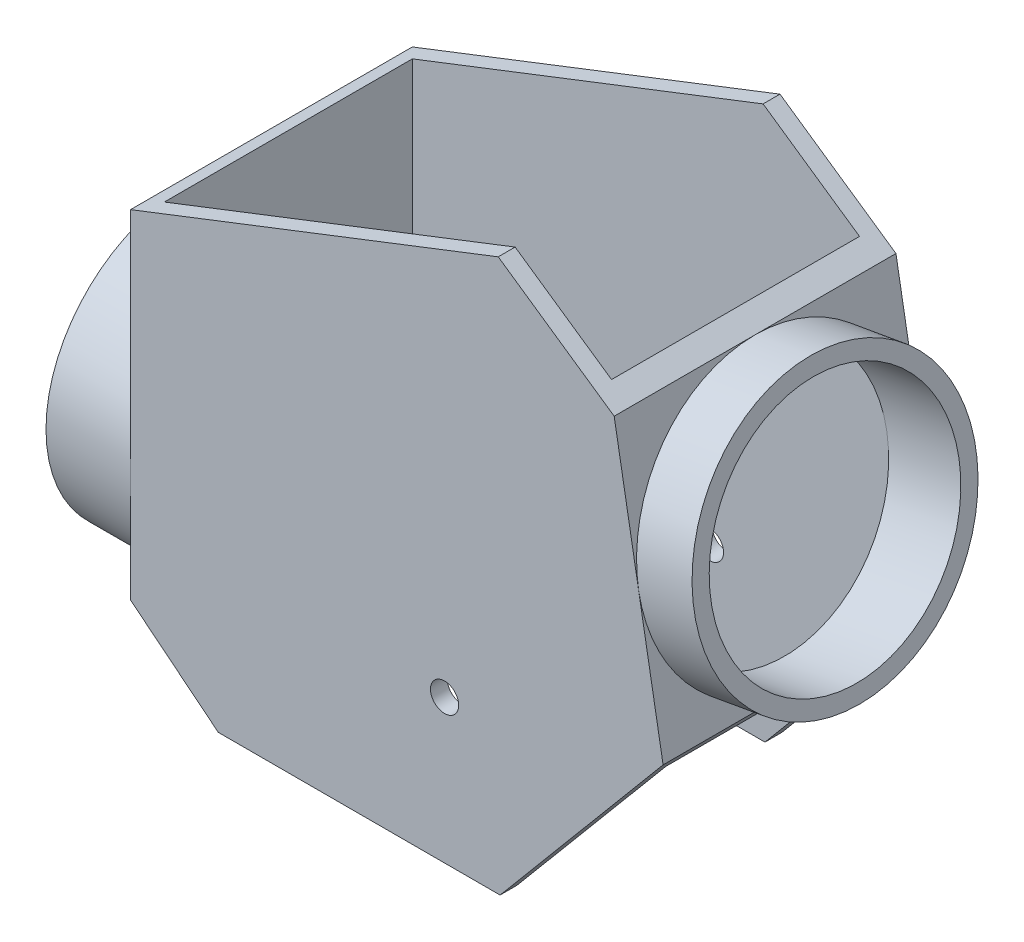
ISO-10303-21;
HEADER;
FILE_DESCRIPTION(('STEP AP214'),'2;1');
FILE_NAME('part.step','',(''),(''),'','','');
FILE_SCHEMA(('AUTOMOTIVE_DESIGN { 1 0 10303 214 1 1 1 1 }'));
ENDSEC;
DATA;
#1=APPLICATION_CONTEXT('core data for automotive mechanical design processes');
#2=APPLICATION_PROTOCOL_DEFINITION('international standard','automotive_design',2000,#1);
#3=PRODUCT_CONTEXT('',#1,'mechanical');
#4=PRODUCT('Part','Part','',(#3));
#5=PRODUCT_RELATED_PRODUCT_CATEGORY('part','',(#4));
#6=PRODUCT_DEFINITION_FORMATION('','',#4);
#7=PRODUCT_DEFINITION_CONTEXT('part definition',#1,'design');
#8=PRODUCT_DEFINITION('design','',#6,#7);
#9=PRODUCT_DEFINITION_SHAPE('','',#8);
#10=(LENGTH_UNIT() NAMED_UNIT(*) SI_UNIT(.MILLI.,.METRE.));
#11=(NAMED_UNIT(*) PLANE_ANGLE_UNIT() SI_UNIT($,.RADIAN.));
#12=(NAMED_UNIT(*) SI_UNIT($,.STERADIAN.) SOLID_ANGLE_UNIT());
#13=UNCERTAINTY_MEASURE_WITH_UNIT(LENGTH_MEASURE(1.E-05),#10,'distance_accuracy_value','');
#14=(GEOMETRIC_REPRESENTATION_CONTEXT(3) GLOBAL_UNCERTAINTY_ASSIGNED_CONTEXT((#13)) GLOBAL_UNIT_ASSIGNED_CONTEXT((#10,
#11,#12)) REPRESENTATION_CONTEXT('',''));
#15=CARTESIAN_POINT('',(0.,0.,0.));
#16=DIRECTION('',(0.,0.,1.));
#17=DIRECTION('',(1.,0.,0.));
#18=AXIS2_PLACEMENT_3D('',#15,#16,#17);
#19=CARTESIAN_POINT('',(33.7650635866321,-34.9755715163721,50.));
#20=DIRECTION('',(0.,1.,0.));
#21=DIRECTION('',(-1.,0.,0.));
#22=AXIS2_PLACEMENT_3D('',#19,#20,#21);
#23=PLANE('',#22);
#24=DIRECTION('',(1.,0.,0.));
#25=VECTOR('',#24,1.);
#26=CARTESIAN_POINT('',(0.,-34.9755715163721,3.));
#27=LINE('',#26,#25);
#28=CARTESIAN_POINT('',(-11.4528098654168,-34.9755715163721,3.));
#29=VERTEX_POINT('',#28);
#30=CARTESIAN_POINT('',(33.7650635866321,-34.9755715163721,3.));
#31=VERTEX_POINT('',#30);
#32=EDGE_CURVE('E227',#29,#31,#27,.T.);
#33=ORIENTED_EDGE('',*,*,#32,.F.);
#34=DIRECTION('',(0.,0.,-1.));
#35=VECTOR('',#34,1.);
#36=CARTESIAN_POINT('',(-11.4528098654168,-34.9755715163721,50.));
#37=LINE('',#36,#35);
#38=CARTESIAN_POINT('',(-11.4528098654168,-34.9755715163721,47.));
#39=VERTEX_POINT('',#38);
#40=EDGE_CURVE('E261',#39,#29,#37,.T.);
#41=ORIENTED_EDGE('',*,*,#40,.F.);
#42=DIRECTION('',(1.,0.,0.));
#43=VECTOR('',#42,1.);
#44=CARTESIAN_POINT('',(0.,-34.9755715163721,47.));
#45=LINE('',#44,#43);
#46=CARTESIAN_POINT('',(33.7650635866321,-34.9755715163721,47.));
#47=VERTEX_POINT('',#46);
#48=EDGE_CURVE('E229',#39,#47,#45,.T.);
#49=ORIENTED_EDGE('',*,*,#48,.T.);
#50=DIRECTION('',(0.,0.,-1.));
#51=VECTOR('',#50,1.);
#52=CARTESIAN_POINT('',(33.7650635866321,-34.9755715163721,50.));
#53=LINE('',#52,#51);
#54=CARTESIAN_POINT('',(33.7650635866321,-34.9755715163721,50.));
#55=VERTEX_POINT('',#54);
#56=EDGE_CURVE('E343',#55,#47,#53,.T.);
#57=ORIENTED_EDGE('',*,*,#56,.F.);
#58=DIRECTION('',(1.,0.,0.));
#59=VECTOR('',#58,1.);
#60=CARTESIAN_POINT('',(33.7650635866321,-34.9755715163721,50.));
#61=LINE('',#60,#59);
#62=CARTESIAN_POINT('',(-16.2349364133679,-34.9755715163721,50.));
#63=VERTEX_POINT('',#62);
#64=EDGE_CURVE('E296',#63,#55,#61,.T.);
#65=ORIENTED_EDGE('',*,*,#64,.F.);
#66=DIRECTION('',(0.,0.,-1.));
#67=VECTOR('',#66,1.);
#68=CARTESIAN_POINT('',(-16.2349364133679,-34.9755715163721,50.));
#69=LINE('',#68,#67);
#70=CARTESIAN_POINT('',(-16.2349364133679,-34.9755715163721,0.));
#71=VERTEX_POINT('',#70);
#72=EDGE_CURVE('E346',#63,#71,#69,.T.);
#73=ORIENTED_EDGE('',*,*,#72,.T.);
#74=DIRECTION('',(1.,0.,0.));
#75=VECTOR('',#74,1.);
#76=CARTESIAN_POINT('',(33.7650635866321,-34.9755715163721,0.));
#77=LINE('',#76,#75);
#78=CARTESIAN_POINT('',(33.7650635866321,-34.9755715163721,0.));
#79=VERTEX_POINT('',#78);
#80=EDGE_CURVE('E314',#71,#79,#77,.T.);
#81=ORIENTED_EDGE('',*,*,#80,.T.);
#82=EDGE_CURVE('E342',#31,#79,#53,.T.);
#83=ORIENTED_EDGE('',*,*,#82,.F.);
#84=EDGE_LOOP('',(#33,#41,#49,#57,#65,#73,#81,#83));
#85=FACE_BOUND('',#84,.T.);
#86=ADVANCED_FACE('F32',(#85),#23,.F.);
#87=CARTESIAN_POINT('',(33.7650635866321,-34.9755715163721,50.));
#88=DIRECTION('',(-0.766044443118974,0.642787609686544,0.));
#89=DIRECTION('',(-0.642787609686544,-0.766044443118974,0.));
#90=AXIS2_PLACEMENT_3D('',#87,#88,#89);
#91=PLANE('',#90);
#92=DIRECTION('',(0.642787609686544,0.766044443118974,0.));
#93=VECTOR('',#92,1.);
#94=CARTESIAN_POINT('',(37.0362596713073,-31.0771118303803,3.));
#95=LINE('',#94,#93);
#96=CARTESIAN_POINT('',(60.1732071289947,-3.50357157601824,3.));
#97=VERTEX_POINT('',#96);
#98=EDGE_CURVE('E248',#31,#97,#95,.T.);
#99=ORIENTED_EDGE('',*,*,#98,.F.);
#100=ORIENTED_EDGE('',*,*,#82,.T.);
#101=DIRECTION('',(0.642787609686543,0.766044443118974,0.));
#102=VECTOR('',#101,1.);
#103=CARTESIAN_POINT('',(33.7650635866321,-34.9755715163721,0.));
#104=LINE('',#103,#102);
#105=CARTESIAN_POINT('',(62.6905060225265,-0.503571576018255,0.));
#106=VERTEX_POINT('',#105);
#107=EDGE_CURVE('E317',#79,#106,#104,.T.);
#108=ORIENTED_EDGE('',*,*,#107,.T.);
#109=DIRECTION('',(0.,0.,-1.));
#110=VECTOR('',#109,1.);
#111=CARTESIAN_POINT('',(62.6905060225265,-0.503571576018255,50.));
#112=LINE('',#111,#110);
#113=CARTESIAN_POINT('',(62.6905060225265,-0.503571576018248,25.));
#114=VERTEX_POINT('',#113);
#115=EDGE_CURVE('E338',#114,#106,#112,.T.);
#116=ORIENTED_EDGE('',*,*,#115,.F.);
#117=CARTESIAN_POINT('',(62.6905060225265,-0.503571576018255,50.));
#118=VERTEX_POINT('',#117);
#119=EDGE_CURVE('E339',#118,#114,#112,.T.);
#120=ORIENTED_EDGE('',*,*,#119,.F.);
#121=DIRECTION('',(0.642787609686543,0.766044443118974,0.));
#122=VECTOR('',#121,1.);
#123=CARTESIAN_POINT('',(33.7650635866321,-34.9755715163721,50.));
#124=LINE('',#123,#122);
#125=EDGE_CURVE('E298',#55,#118,#124,.T.);
#126=ORIENTED_EDGE('',*,*,#125,.F.);
#127=ORIENTED_EDGE('',*,*,#56,.T.);
#128=DIRECTION('',(0.642787609686544,0.766044443118974,0.));
#129=VECTOR('',#128,1.);
#130=CARTESIAN_POINT('',(37.0362596713073,-31.0771118303803,47.));
#131=LINE('',#130,#129);
#132=CARTESIAN_POINT('',(60.1732071289947,-3.50357157601824,47.));
#133=VERTEX_POINT('',#132);
#134=EDGE_CURVE('E234',#47,#133,#131,.T.);
#135=ORIENTED_EDGE('',*,*,#134,.T.);
#136=DIRECTION('',(0.,0.,-1.));
#137=VECTOR('',#136,1.);
#138=CARTESIAN_POINT('',(60.1732071289947,-3.50357157601824,50.));
#139=LINE('',#138,#137);
#140=EDGE_CURVE('E258',#133,#97,#139,.T.);
#141=ORIENTED_EDGE('',*,*,#140,.T.);
#142=EDGE_LOOP('',(#99,#100,#108,#116,#120,#126,#127,#135,#141));
#143=FACE_BOUND('',#142,.T.);
#144=ADVANCED_FACE('F419',(#143),#91,.F.);
#145=CARTESIAN_POINT('',(54.0080971391801,48.7368160745922,50.));
#146=DIRECTION('',(-0.568007364011867,-0.823023471371437,0.));
#147=DIRECTION('',(0.823023471371437,-0.568007364011867,0.));
#148=AXIS2_PLACEMENT_3D('',#145,#146,#147);
#149=PLANE('',#148);
#150=DIRECTION('',(-0.823023471371437,0.568007364011867,0.));
#151=VECTOR('',#150,1.);
#152=CARTESIAN_POINT('',(40.2084122579267,58.2606302867602,3.));
#153=LINE('',#152,#151);
#154=CARTESIAN_POINT('',(50.5397484893658,51.1304872669488,3.));
#155=VERTEX_POINT('',#154);
#156=CARTESIAN_POINT('',(33.4325103548942,62.9370001748888,3.));
#157=VERTEX_POINT('',#156);
#158=EDGE_CURVE('E242',#155,#157,#153,.T.);
#159=ORIENTED_EDGE('',*,*,#158,.F.);
#160=DIRECTION('',(0.,0.,-1.));
#161=VECTOR('',#160,1.);
#162=CARTESIAN_POINT('',(50.5397484893658,51.1304872669488,50.));
#163=LINE('',#162,#161);
#164=CARTESIAN_POINT('',(50.5397484893658,51.1304872669488,47.));
#165=VERTEX_POINT('',#164);
#166=EDGE_CURVE('E251',#165,#155,#163,.T.);
#167=ORIENTED_EDGE('',*,*,#166,.F.);
#168=DIRECTION('',(-0.823023471371437,0.568007364011867,0.));
#169=VECTOR('',#168,1.);
#170=CARTESIAN_POINT('',(40.2084122579267,58.2606302867602,47.));
#171=LINE('',#170,#169);
#172=CARTESIAN_POINT('',(33.4325103548942,62.9370001748888,47.));
#173=VERTEX_POINT('',#172);
#174=EDGE_CURVE('E231',#165,#173,#171,.T.);
#175=ORIENTED_EDGE('',*,*,#174,.T.);
#176=DIRECTION('',(0.,0.,-1.));
#177=VECTOR('',#176,1.);
#178=CARTESIAN_POINT('',(33.4325103548942,62.9370001748888,50.));
#179=LINE('',#178,#177);
#180=CARTESIAN_POINT('',(33.4325103548942,62.9370001748888,50.));
#181=VERTEX_POINT('',#180);
#182=EDGE_CURVE('E332',#181,#173,#179,.T.);
#183=ORIENTED_EDGE('',*,*,#182,.F.);
#184=DIRECTION('',(-0.823023471371437,0.568007364011867,0.));
#185=VECTOR('',#184,1.);
#186=CARTESIAN_POINT('',(54.0080971391801,48.7368160745922,50.));
#187=LINE('',#186,#185);
#188=CARTESIAN_POINT('',(54.0080971391801,48.7368160745922,50.));
#189=VERTEX_POINT('',#188);
#190=EDGE_CURVE('E304',#189,#181,#187,.T.);
#191=ORIENTED_EDGE('',*,*,#190,.F.);
#192=DIRECTION('',(0.,0.,-1.));
#193=VECTOR('',#192,1.);
#194=CARTESIAN_POINT('',(54.0080971391801,48.7368160745922,50.));
#195=LINE('',#194,#193);
#196=CARTESIAN_POINT('',(54.0080971391801,48.7368160745922,25.));
#197=VERTEX_POINT('',#196);
#198=EDGE_CURVE('E336',#189,#197,#195,.T.);
#199=ORIENTED_EDGE('',*,*,#198,.T.);
#200=CARTESIAN_POINT('',(54.0080971391801,48.7368160745922,0.));
#201=VERTEX_POINT('',#200);
#202=EDGE_CURVE('E335',#197,#201,#195,.T.);
#203=ORIENTED_EDGE('',*,*,#202,.T.);
#204=DIRECTION('',(-0.823023471371437,0.568007364011867,0.));
#205=VECTOR('',#204,1.);
#206=CARTESIAN_POINT('',(54.0080971391801,48.7368160745922,0.));
#207=LINE('',#206,#205);
#208=CARTESIAN_POINT('',(33.4325103548942,62.9370001748888,0.));
#209=VERTEX_POINT('',#208);
#210=EDGE_CURVE('E324',#201,#209,#207,.T.);
#211=ORIENTED_EDGE('',*,*,#210,.T.);
#212=EDGE_CURVE('E331',#157,#209,#179,.T.);
#213=ORIENTED_EDGE('',*,*,#212,.F.);
#214=EDGE_LOOP('',(#159,#167,#175,#183,#191,#199,#203,#211,#213));
#215=FACE_BOUND('',#214,.T.);
#216=ADVANCED_FACE('F394',(#215),#149,.F.);
#217=CARTESIAN_POINT('',(33.4325103548942,62.9370001748888,50.));
#218=DIRECTION('',(0.362369318244743,-0.932034590127877,0.));
#219=DIRECTION('',(0.932034590127877,0.362369318244743,0.));
#220=AXIS2_PLACEMENT_3D('',#217,#218,#219);
#221=PLANE('',#220);
#222=DIRECTION('',(-0.932034590127877,-0.362369318244743,0.));
#223=VECTOR('',#222,1.);
#224=CARTESIAN_POINT('',(-16.8663151039342,43.3811260870761,3.));
#225=LINE('',#224,#223);
#226=CARTESIAN_POINT('',(-28.8099109540572,38.7375294529576,3.));
#227=VERTEX_POINT('',#226);
#228=EDGE_CURVE('E202',#157,#227,#225,.T.);
#229=ORIENTED_EDGE('',*,*,#228,.F.);
#230=ORIENTED_EDGE('',*,*,#212,.T.);
#231=DIRECTION('',(-0.932034590127877,-0.362369318244743,0.));
#232=VECTOR('',#231,1.);
#233=CARTESIAN_POINT('',(33.4325103548942,62.9370001748888,0.));
#234=LINE('',#233,#232);
#235=CARTESIAN_POINT('',(-31.8099109540572,37.5711478977569,0.));
#236=VERTEX_POINT('',#235);
#237=EDGE_CURVE('E327',#209,#236,#234,.T.);
#238=ORIENTED_EDGE('',*,*,#237,.T.);
#239=DIRECTION('',(0.,0.,-1.));
#240=VECTOR('',#239,1.);
#241=CARTESIAN_POINT('',(-31.8099109540572,37.5711478977569,50.));
#242=LINE('',#241,#240);
#243=CARTESIAN_POINT('',(-31.8099109540572,37.5711478977569,50.));
#244=VERTEX_POINT('',#243);
#245=EDGE_CURVE('E308',#244,#236,#242,.T.);
#246=ORIENTED_EDGE('',*,*,#245,.F.);
#247=DIRECTION('',(-0.932034590127877,-0.362369318244743,0.));
#248=VECTOR('',#247,1.);
#249=CARTESIAN_POINT('',(33.4325103548942,62.9370001748888,50.));
#250=LINE('',#249,#248);
#251=EDGE_CURVE('E306',#181,#244,#250,.T.);
#252=ORIENTED_EDGE('',*,*,#251,.F.);
#253=ORIENTED_EDGE('',*,*,#182,.T.);
#254=DIRECTION('',(-0.932034590127877,-0.362369318244743,0.));
#255=VECTOR('',#254,1.);
#256=CARTESIAN_POINT('',(-16.8663151039342,43.3811260870761,47.));
#257=LINE('',#256,#255);
#258=CARTESIAN_POINT('',(-28.8099109540572,38.7375294529576,47.));
#259=VERTEX_POINT('',#258);
#260=EDGE_CURVE('E252',#173,#259,#257,.T.);
#261=ORIENTED_EDGE('',*,*,#260,.T.);
#262=DIRECTION('',(0.,0.,-1.));
#263=VECTOR('',#262,1.);
#264=CARTESIAN_POINT('',(-28.8099109540572,38.7375294529576,50.));
#265=LINE('',#264,#263);
#266=EDGE_CURVE('E249',#259,#227,#265,.T.);
#267=ORIENTED_EDGE('',*,*,#266,.T.);
#268=EDGE_LOOP('',(#229,#230,#238,#246,#252,#253,#261,#267));
#269=FACE_BOUND('',#268,.T.);
#270=ADVANCED_FACE('F389',(#269),#221,.F.);
#271=CARTESIAN_POINT('',(-31.8099109540572,37.5711478977569,50.));
#272=DIRECTION('',(1.,0.,0.));
#273=DIRECTION('',(0.,0.,-1.));
#274=AXIS2_PLACEMENT_3D('',#271,#272,#273);
#275=PLANE('',#274);
#276=CARTESIAN_POINT('',(-31.8099109540572,-3.70221180930763,25.));
#277=DIRECTION('',(1.,0.,0.));
#278=DIRECTION('',(0.,0.,-1.));
#279=AXIS2_PLACEMENT_3D('',#276,#277,#278);
#280=CIRCLE('',#279,25.);
#281=CARTESIAN_POINT('',(-31.8099109540572,-3.70221180930763,0.));
#282=VERTEX_POINT('',#281);
#283=CARTESIAN_POINT('',(-31.8099109540572,-22.4288521022431,8.43760454103923));
#284=VERTEX_POINT('',#283);
#285=EDGE_CURVE('E280',#282,#284,#280,.F.);
#286=ORIENTED_EDGE('',*,*,#285,.F.);
#287=DIRECTION('',(0.,-1.,0.));
#288=VECTOR('',#287,1.);
#289=CARTESIAN_POINT('',(-31.8099109540572,37.5711478977569,0.));
#290=LINE('',#289,#288);
#291=CARTESIAN_POINT('',(-31.8099109540572,-22.4288521022431,0.));
#292=VERTEX_POINT('',#291);
#293=EDGE_CURVE('E286',#282,#292,#290,.T.);
#294=ORIENTED_EDGE('',*,*,#293,.T.);
#295=DIRECTION('',(0.,0.,-1.));
#296=VECTOR('',#295,1.);
#297=CARTESIAN_POINT('',(-31.8099109540572,-22.4288521022431,50.));
#298=LINE('',#297,#296);
#299=EDGE_CURVE('E348',#284,#292,#298,.T.);
#300=ORIENTED_EDGE('',*,*,#299,.F.);
#301=EDGE_LOOP('',(#286,#294,#300));
#302=FACE_BOUND('',#301,.T.);
#303=ADVANCED_FACE('F363',(#302),#275,.F.);
#304=CARTESIAN_POINT('',(-31.8099109540572,-22.4288521022431,41.5623954589608));
#305=VERTEX_POINT('',#304);
#306=CARTESIAN_POINT('',(-31.8099109540572,-3.70221180930763,50.));
#307=VERTEX_POINT('',#306);
#308=EDGE_CURVE('E279',#305,#307,#280,.F.);
#309=ORIENTED_EDGE('',*,*,#308,.F.);
#310=CARTESIAN_POINT('',(-31.8099109540572,-22.4288521022431,50.));
#311=VERTEX_POINT('',#310);
#312=EDGE_CURVE('E349',#311,#305,#298,.T.);
#313=ORIENTED_EDGE('',*,*,#312,.F.);
#314=DIRECTION('',(0.,-1.,0.));
#315=VECTOR('',#314,1.);
#316=CARTESIAN_POINT('',(-31.8099109540572,37.5711478977569,50.));
#317=LINE('',#316,#315);
#318=EDGE_CURVE('E294',#307,#311,#317,.T.);
#319=ORIENTED_EDGE('',*,*,#318,.F.);
#320=EDGE_LOOP('',(#309,#313,#319));
#321=FACE_BOUND('',#320,.T.);
#322=ADVANCED_FACE('F378',(#321),#275,.F.);
#323=CARTESIAN_POINT('',(62.6905060225265,-0.503571576018255,50.));
#324=DIRECTION('',(-0.984807753012208,-0.173648177666928,0.));
#325=DIRECTION('',(0.173648177666928,-0.984807753012209,0.));
#326=AXIS2_PLACEMENT_3D('',#323,#324,#325);
#327=PLANE('',#326);
#328=CARTESIAN_POINT('',(58.3493015808533,24.116622249287,25.));
#329=DIRECTION('',(0.984807753012208,0.173648177666928,0.));
#330=DIRECTION('',(-0.173648177666928,0.984807753012208,0.));
#331=AXIS2_PLACEMENT_3D('',#328,#329,#330);
#332=CIRCLE('',#331,25.);
#333=CARTESIAN_POINT('',(58.3493015808533,24.116622249287,50.));
#334=VERTEX_POINT('',#333);
#335=EDGE_CURVE('E43',#197,#334,#332,.T.);
#336=ORIENTED_EDGE('',*,*,#335,.F.);
#337=ORIENTED_EDGE('',*,*,#198,.F.);
#338=DIRECTION('',(-0.173648177666928,0.984807753012208,0.));
#339=VECTOR('',#338,1.);
#340=CARTESIAN_POINT('',(62.6905060225265,-0.503571576018255,50.));
#341=LINE('',#340,#339);
#342=EDGE_CURVE('E300',#334,#189,#341,.T.);
#343=ORIENTED_EDGE('',*,*,#342,.F.);
#344=EDGE_LOOP('',(#336,#337,#343));
#345=FACE_BOUND('',#344,.T.);
#346=ADVANCED_FACE('F414',(#345),#327,.F.);
#347=EDGE_CURVE('E11',#334,#114,#332,.T.);
#348=ORIENTED_EDGE('',*,*,#347,.F.);
#349=EDGE_CURVE('E301',#118,#334,#341,.T.);
#350=ORIENTED_EDGE('',*,*,#349,.F.);
#351=ORIENTED_EDGE('',*,*,#119,.T.);
#352=EDGE_LOOP('',(#348,#350,#351));
#353=FACE_BOUND('',#352,.T.);
#354=ADVANCED_FACE('F411',(#353),#327,.F.);
#355=CARTESIAN_POINT('',(58.3493015808533,24.116622249287,0.));
#356=VERTEX_POINT('',#355);
#357=EDGE_CURVE('E41',#114,#356,#332,.T.);
#358=ORIENTED_EDGE('',*,*,#357,.F.);
#359=ORIENTED_EDGE('',*,*,#115,.T.);
#360=DIRECTION('',(-0.173648177666928,0.984807753012208,0.));
#361=VECTOR('',#360,1.);
#362=CARTESIAN_POINT('',(62.6905060225265,-0.503571576018255,0.));
#363=LINE('',#362,#361);
#364=EDGE_CURVE('E321',#106,#356,#363,.T.);
#365=ORIENTED_EDGE('',*,*,#364,.T.);
#366=EDGE_LOOP('',(#358,#359,#365));
#367=FACE_BOUND('',#366,.T.);
#368=ADVANCED_FACE('F404',(#367),#327,.F.);
#369=EDGE_CURVE('E276',#307,#282,#280,.F.);
#370=ORIENTED_EDGE('',*,*,#369,.F.);
#371=EDGE_CURVE('E290',#244,#307,#317,.T.);
#372=ORIENTED_EDGE('',*,*,#371,.F.);
#373=ORIENTED_EDGE('',*,*,#245,.T.);
#374=EDGE_CURVE('E309',#236,#282,#290,.T.);
#375=ORIENTED_EDGE('',*,*,#374,.T.);
#376=EDGE_LOOP('',(#370,#372,#373,#375));
#377=FACE_BOUND('',#376,.T.);
#378=ADVANCED_FACE('F34',(#377),#275,.F.);
#379=CARTESIAN_POINT('',(-31.8099109540572,-22.4288521022431,50.));
#380=DIRECTION('',(0.627335970706448,0.778748727034464,0.));
#381=DIRECTION('',(-0.778748727034464,0.627335970706448,0.));
#382=AXIS2_PLACEMENT_3D('',#379,#380,#381);
#383=PLANE('',#382);
#384=CARTESIAN_POINT('',(-55.0563816981681,-3.70221180930763,25.));
#385=DIRECTION('',(0.627335970706448,0.778748727034464,0.));
#386=DIRECTION('',(0.778748727034464,-0.627335970706448,0.));
#387=AXIS2_PLACEMENT_3D('',#384,#385,#386);
#388=ELLIPSE('',#387,39.8510545662594,25.);
#389=EDGE_CURVE('E281',#284,#305,#388,.F.);
#390=ORIENTED_EDGE('',*,*,#389,.F.);
#391=ORIENTED_EDGE('',*,*,#299,.T.);
#392=DIRECTION('',(0.778748727034464,-0.627335970706449,0.));
#393=VECTOR('',#392,1.);
#394=CARTESIAN_POINT('',(-31.8099109540572,-22.4288521022431,0.));
#395=LINE('',#394,#393);
#396=EDGE_CURVE('E312',#292,#71,#395,.T.);
#397=ORIENTED_EDGE('',*,*,#396,.T.);
#398=ORIENTED_EDGE('',*,*,#72,.F.);
#399=DIRECTION('',(0.778748727034464,-0.627335970706449,0.));
#400=VECTOR('',#399,1.);
#401=CARTESIAN_POINT('',(-31.8099109540572,-22.4288521022431,50.));
#402=LINE('',#401,#400);
#403=EDGE_CURVE('E293',#311,#63,#402,.T.);
#404=ORIENTED_EDGE('',*,*,#403,.F.);
#405=ORIENTED_EDGE('',*,*,#312,.T.);
#406=EDGE_LOOP('',(#390,#391,#397,#398,#404,#405));
#407=FACE_BOUND('',#406,.T.);
#408=ADVANCED_FACE('F357',(#407),#383,.F.);
#409=EDGE_CURVE('E289',#356,#197,#332,.T.);
#410=ORIENTED_EDGE('',*,*,#409,.F.);
#411=EDGE_CURVE('E320',#356,#201,#363,.T.);
#412=ORIENTED_EDGE('',*,*,#411,.T.);
#413=ORIENTED_EDGE('',*,*,#202,.F.);
#414=EDGE_LOOP('',(#410,#412,#413));
#415=FACE_BOUND('',#414,.T.);
#416=ADVANCED_FACE('F401',(#415),#327,.F.);
#417=CARTESIAN_POINT('',(0.,0.,50.));
#418=DIRECTION('',(0.,0.,-1.));
#419=DIRECTION('',(-1.,0.,0.));
#420=AXIS2_PLACEMENT_3D('',#417,#418,#419);
#421=PLANE('',#420);
#422=CARTESIAN_POINT('',(23.9150067404,-9.49997314232794,50.));
#423=DIRECTION('',(0.,0.,1.));
#424=DIRECTION('',(1.,0.,0.));
#425=AXIS2_PLACEMENT_3D('',#422,#423,#424);
#426=CIRCLE('',#425,2.5);
#427=CARTESIAN_POINT('',(26.4150067404,-9.49997314232794,50.));
#428=VERTEX_POINT('',#427);
#429=EDGE_CURVE('E693',#428,#428,#426,.T.);
#430=ORIENTED_EDGE('',*,*,#429,.F.);
#431=EDGE_LOOP('',(#430));
#432=FACE_BOUND('',#431,.T.);
#433=ORIENTED_EDGE('',*,*,#371,.T.);
#434=ORIENTED_EDGE('',*,*,#318,.T.);
#435=ORIENTED_EDGE('',*,*,#403,.T.);
#436=ORIENTED_EDGE('',*,*,#64,.T.);
#437=ORIENTED_EDGE('',*,*,#125,.T.);
#438=ORIENTED_EDGE('',*,*,#349,.T.);
#439=ORIENTED_EDGE('',*,*,#342,.T.);
#440=ORIENTED_EDGE('',*,*,#190,.T.);
#441=ORIENTED_EDGE('',*,*,#251,.T.);
#442=EDGE_LOOP('',(#433,#434,#435,#436,#437,#438,#439,#440,#441));
#443=FACE_BOUND('',#442,.T.);
#444=ADVANCED_FACE('F415',(#432,#443),#421,.F.);
#445=CARTESIAN_POINT('',(0.,0.,0.));
#446=DIRECTION('',(0.,0.,-1.));
#447=DIRECTION('',(-1.,0.,0.));
#448=AXIS2_PLACEMENT_3D('',#445,#446,#447);
#449=PLANE('',#448);
#450=CARTESIAN_POINT('',(23.9150067404,-9.49997314232794,0.));
#451=DIRECTION('',(0.,0.,1.));
#452=DIRECTION('',(1.,0.,0.));
#453=AXIS2_PLACEMENT_3D('',#450,#451,#452);
#454=CIRCLE('',#453,2.5);
#455=CARTESIAN_POINT('',(26.4150067404,-9.49997314232794,0.));
#456=VERTEX_POINT('',#455);
#457=EDGE_CURVE('E694',#456,#456,#454,.T.);
#458=ORIENTED_EDGE('',*,*,#457,.T.);
#459=EDGE_LOOP('',(#458));
#460=FACE_BOUND('',#459,.T.);
#461=ORIENTED_EDGE('',*,*,#293,.F.);
#462=ORIENTED_EDGE('',*,*,#374,.F.);
#463=ORIENTED_EDGE('',*,*,#237,.F.);
#464=ORIENTED_EDGE('',*,*,#210,.F.);
#465=ORIENTED_EDGE('',*,*,#411,.F.);
#466=ORIENTED_EDGE('',*,*,#364,.F.);
#467=ORIENTED_EDGE('',*,*,#107,.F.);
#468=ORIENTED_EDGE('',*,*,#80,.F.);
#469=ORIENTED_EDGE('',*,*,#396,.F.);
#470=EDGE_LOOP('',(#461,#462,#463,#464,#465,#466,#467,#468,#469));
#471=FACE_BOUND('',#470,.T.);
#472=ADVANCED_FACE('F367',(#460,#471),#449,.T.);
#473=CARTESIAN_POINT('',(68.1973791109754,25.8531040259562,25.));
#474=DIRECTION('',(-0.984807753012209,-0.173648177666928,0.));
#475=DIRECTION('',(0.173648177666928,-0.984807753012209,0.));
#476=AXIS2_PLACEMENT_3D('',#473,#474,#475);
#477=CYLINDRICAL_SURFACE('',#476,25.);
#478=CARTESIAN_POINT('',(68.1973791109754,25.8531040259562,25.));
#479=DIRECTION('',(0.984807753012208,0.173648177666928,0.));
#480=DIRECTION('',(-0.173648177666928,0.984807753012208,0.));
#481=AXIS2_PLACEMENT_3D('',#478,#479,#480);
#482=CIRCLE('',#481,25.);
#483=CARTESIAN_POINT('',(63.8561746693022,50.4732978512614,25.));
#484=VERTEX_POINT('',#483);
#485=EDGE_CURVE('E284',#484,#484,#482,.T.);
#486=ORIENTED_EDGE('',*,*,#485,.F.);
#487=EDGE_LOOP('',(#486));
#488=FACE_BOUND('',#487,.T.);
#489=ORIENTED_EDGE('',*,*,#335,.T.);
#490=ORIENTED_EDGE('',*,*,#347,.T.);
#491=ORIENTED_EDGE('',*,*,#357,.T.);
#492=ORIENTED_EDGE('',*,*,#409,.T.);
#493=EDGE_LOOP('',(#489,#490,#491,#492));
#494=FACE_BOUND('',#493,.T.);
#495=ADVANCED_FACE('F407',(#488,#494),#477,.T.);
#496=CARTESIAN_POINT('',(68.1973791109754,25.8531040259562,25.));
#497=DIRECTION('',(0.984807753012208,0.173648177666928,0.));
#498=DIRECTION('',(-0.173648177666928,0.984807753012208,0.));
#499=AXIS2_PLACEMENT_3D('',#496,#497,#498);
#500=PLANE('',#499);
#501=CARTESIAN_POINT('',(68.1973791109754,25.8531040259562,25.));
#502=DIRECTION('',(0.984807753012208,0.173648177666928,0.));
#503=DIRECTION('',(-0.173648177666928,0.984807753012208,0.));
#504=AXIS2_PLACEMENT_3D('',#501,#502,#503);
#505=CIRCLE('',#504,22.);
#506=CARTESIAN_POINT('',(64.377119202303,47.5188745922248,25.));
#507=VERTEX_POINT('',#506);
#508=EDGE_CURVE('E188',#507,#507,#505,.T.);
#509=ORIENTED_EDGE('',*,*,#508,.F.);
#510=EDGE_LOOP('',(#509));
#511=FACE_BOUND('',#510,.T.);
#512=ORIENTED_EDGE('',*,*,#485,.T.);
#513=EDGE_LOOP('',(#512));
#514=FACE_BOUND('',#513,.T.);
#515=ADVANCED_FACE('F481',(#511,#514),#500,.T.);
#516=CARTESIAN_POINT('',(-46.8099109540572,-3.70221180930763,25.));
#517=DIRECTION('',(1.,0.,0.));
#518=DIRECTION('',(0.,0.,-1.));
#519=AXIS2_PLACEMENT_3D('',#516,#517,#518);
#520=CYLINDRICAL_SURFACE('',#519,25.);
#521=CARTESIAN_POINT('',(-46.8099109540572,-3.70221180930763,25.));
#522=DIRECTION('',(-1.,0.,0.));
#523=DIRECTION('',(0.,0.,1.));
#524=AXIS2_PLACEMENT_3D('',#521,#522,#523);
#525=CIRCLE('',#524,25.);
#526=CARTESIAN_POINT('',(-46.8099109540572,-3.70221180930763,50.));
#527=VERTEX_POINT('',#526);
#528=EDGE_CURVE('E238',#527,#527,#525,.T.);
#529=ORIENTED_EDGE('',*,*,#528,.F.);
#530=EDGE_LOOP('',(#529));
#531=FACE_BOUND('',#530,.T.);
#532=ORIENTED_EDGE('',*,*,#369,.T.);
#533=ORIENTED_EDGE('',*,*,#285,.T.);
#534=ORIENTED_EDGE('',*,*,#389,.T.);
#535=ORIENTED_EDGE('',*,*,#308,.T.);
#536=EDGE_LOOP('',(#532,#533,#534,#535));
#537=FACE_BOUND('',#536,.T.);
#538=ADVANCED_FACE('F381',(#531,#537),#520,.T.);
#539=CARTESIAN_POINT('',(-46.8099109540572,-3.70221180930763,25.));
#540=DIRECTION('',(-1.,0.,0.));
#541=DIRECTION('',(0.,0.,1.));
#542=AXIS2_PLACEMENT_3D('',#539,#540,#541);
#543=PLANE('',#542);
#544=CARTESIAN_POINT('',(-46.8099109540572,-3.70221180930763,25.));
#545=DIRECTION('',(-1.,0.,0.));
#546=DIRECTION('',(0.,0.,1.));
#547=AXIS2_PLACEMENT_3D('',#544,#545,#546);
#548=CIRCLE('',#547,22.);
#549=CARTESIAN_POINT('',(-46.8099109540572,-3.70221180930763,47.));
#550=VERTEX_POINT('',#549);
#551=EDGE_CURVE('E210',#550,#550,#548,.T.);
#552=ORIENTED_EDGE('',*,*,#551,.F.);
#553=EDGE_LOOP('',(#552));
#554=FACE_BOUND('',#553,.T.);
#555=ORIENTED_EDGE('',*,*,#528,.T.);
#556=EDGE_LOOP('',(#555));
#557=FACE_BOUND('',#556,.T.);
#558=ADVANCED_FACE('F488',(#554,#557),#543,.T.);
#559=CARTESIAN_POINT('',(-28.8099109540572,37.5711478977569,50.));
#560=DIRECTION('',(1.,0.,0.));
#561=DIRECTION('',(0.,0.,-1.));
#562=AXIS2_PLACEMENT_3D('',#559,#560,#561);
#563=PLANE('',#562);
#564=CARTESIAN_POINT('',(-28.8099109540572,-3.70221180930763,25.));
#565=DIRECTION('',(1.,0.,0.));
#566=DIRECTION('',(0.,0.,-1.));
#567=AXIS2_PLACEMENT_3D('',#564,#565,#566);
#568=CIRCLE('',#567,22.);
#569=CARTESIAN_POINT('',(-28.8099109540572,-3.70221180930763,3.));
#570=VERTEX_POINT('',#569);
#571=CARTESIAN_POINT('',(-28.8099109540572,-20.9932258866626,11.3977637067755));
#572=VERTEX_POINT('',#571);
#573=EDGE_CURVE('E178',#570,#572,#568,.F.);
#574=ORIENTED_EDGE('',*,*,#573,.T.);
#575=DIRECTION('',(0.,0.,-1.));
#576=VECTOR('',#575,1.);
#577=CARTESIAN_POINT('',(-28.8099109540572,-20.9932258866626,50.));
#578=LINE('',#577,#576);
#579=CARTESIAN_POINT('',(-28.8099109540572,-20.9932258866626,3.));
#580=VERTEX_POINT('',#579);
#581=EDGE_CURVE('E194',#572,#580,#578,.T.);
#582=ORIENTED_EDGE('',*,*,#581,.T.);
#583=DIRECTION('',(0.,-1.,0.));
#584=VECTOR('',#583,1.);
#585=CARTESIAN_POINT('',(-28.8099109540572,0.,3.));
#586=LINE('',#585,#584);
#587=EDGE_CURVE('E191',#570,#580,#586,.T.);
#588=ORIENTED_EDGE('',*,*,#587,.F.);
#589=EDGE_LOOP('',(#574,#582,#588));
#590=FACE_BOUND('',#589,.T.);
#591=ADVANCED_FACE('F193',(#590),#563,.T.);
#592=CARTESIAN_POINT('',(-28.8099109540572,-3.70221180930763,25.));
#593=DIRECTION('',(1.,0.,0.));
#594=DIRECTION('',(0.,0.,-1.));
#595=AXIS2_PLACEMENT_3D('',#592,#593,#594);
#596=CIRCLE('',#595,22.);
#597=CARTESIAN_POINT('',(-28.8099109540572,-20.9932258866626,38.6022362932245));
#598=VERTEX_POINT('',#597);
#599=CARTESIAN_POINT('',(-28.8099109540572,-3.70221180930763,47.));
#600=VERTEX_POINT('',#599);
#601=EDGE_CURVE('E209',#598,#600,#596,.F.);
#602=ORIENTED_EDGE('',*,*,#601,.T.);
#603=DIRECTION('',(0.,-1.,0.));
#604=VECTOR('',#603,1.);
#605=CARTESIAN_POINT('',(-28.8099109540572,0.,47.));
#606=LINE('',#605,#604);
#607=CARTESIAN_POINT('',(-28.8099109540572,-20.9932258866626,47.));
#608=VERTEX_POINT('',#607);
#609=EDGE_CURVE('E219',#600,#608,#606,.T.);
#610=ORIENTED_EDGE('',*,*,#609,.T.);
#611=DIRECTION('',(0.,0.,-1.));
#612=VECTOR('',#611,1.);
#613=CARTESIAN_POINT('',(-28.8099109540572,-20.9932258866626,50.));
#614=LINE('',#613,#612);
#615=EDGE_CURVE('E221',#608,#598,#614,.T.);
#616=ORIENTED_EDGE('',*,*,#615,.T.);
#617=EDGE_LOOP('',(#602,#610,#616));
#618=FACE_BOUND('',#617,.T.);
#619=ADVANCED_FACE('F563',(#618),#563,.T.);
#620=CARTESIAN_POINT('',(59.7360827634899,-1.02451610901904,50.));
#621=DIRECTION('',(-0.984807753012208,-0.173648177666928,0.));
#622=DIRECTION('',(0.173648177666928,-0.984807753012209,0.));
#623=AXIS2_PLACEMENT_3D('',#620,#621,#622);
#624=PLANE('',#623);
#625=CARTESIAN_POINT('',(55.3948783218167,23.5956777162862,25.));
#626=DIRECTION('',(-0.984807753012208,-0.173648177666928,0.));
#627=DIRECTION('',(0.173648177666928,-0.984807753012209,0.));
#628=AXIS2_PLACEMENT_3D('',#625,#626,#627);
#629=CIRCLE('',#628,22.);
#630=CARTESIAN_POINT('',(55.3948783218167,23.5956777162862,47.));
#631=VERTEX_POINT('',#630);
#632=CARTESIAN_POINT('',(55.3948783218167,23.5956777162862,3.));
#633=VERTEX_POINT('',#632);
#634=EDGE_CURVE('E235',#631,#633,#629,.F.);
#635=ORIENTED_EDGE('',*,*,#634,.T.);
#636=DIRECTION('',(-0.173648177666928,0.984807753012209,0.));
#637=VECTOR('',#636,1.);
#638=CARTESIAN_POINT('',(57.7596168922758,10.1845788534925,3.));
#639=LINE('',#638,#637);
#640=EDGE_CURVE('E239',#97,#633,#639,.T.);
#641=ORIENTED_EDGE('',*,*,#640,.F.);
#642=ORIENTED_EDGE('',*,*,#140,.F.);
#643=DIRECTION('',(-0.173648177666928,0.984807753012209,0.));
#644=VECTOR('',#643,1.);
#645=CARTESIAN_POINT('',(57.7596168922758,10.1845788534925,47.));
#646=LINE('',#645,#644);
#647=EDGE_CURVE('E50',#133,#631,#646,.T.);
#648=ORIENTED_EDGE('',*,*,#647,.T.);
#649=EDGE_LOOP('',(#635,#641,#642,#648));
#650=FACE_BOUND('',#649,.T.);
#651=ADVANCED_FACE('F422',(#650),#624,.T.);
#652=CARTESIAN_POINT('',(-28.8099109540572,-3.70221180930763,25.));
#653=DIRECTION('',(1.,0.,0.));
#654=DIRECTION('',(0.,0.,-1.));
#655=AXIS2_PLACEMENT_3D('',#652,#653,#654);
#656=CIRCLE('',#655,22.);
#657=EDGE_CURVE('E183',#600,#570,#656,.F.);
#658=ORIENTED_EDGE('',*,*,#657,.T.);
#659=DIRECTION('',(0.,-1.,0.));
#660=VECTOR('',#659,1.);
#661=CARTESIAN_POINT('',(-28.8099109540572,0.,3.));
#662=LINE('',#661,#660);
#663=EDGE_CURVE('E197',#227,#570,#662,.T.);
#664=ORIENTED_EDGE('',*,*,#663,.F.);
#665=ORIENTED_EDGE('',*,*,#266,.F.);
#666=DIRECTION('',(0.,-1.,0.));
#667=VECTOR('',#666,1.);
#668=CARTESIAN_POINT('',(-28.8099109540572,0.,47.));
#669=LINE('',#668,#667);
#670=EDGE_CURVE('E57',#259,#600,#669,.T.);
#671=ORIENTED_EDGE('',*,*,#670,.T.);
#672=EDGE_LOOP('',(#658,#664,#665,#671));
#673=FACE_BOUND('',#672,.T.);
#674=ADVANCED_FACE('F207',(#673),#563,.T.);
#675=CARTESIAN_POINT('',(-29.9279030419379,-20.0926059211398,50.));
#676=DIRECTION('',(0.627335970706448,0.778748727034464,0.));
#677=DIRECTION('',(-0.778748727034464,0.627335970706448,0.));
#678=AXIS2_PLACEMENT_3D('',#675,#676,#677);
#679=PLANE('',#678);
#680=CARTESIAN_POINT('',(-50.2742551502169,-3.70221180930763,25.));
#681=DIRECTION('',(0.627335970706448,0.778748727034464,0.));
#682=DIRECTION('',(0.778748727034464,-0.627335970706448,0.));
#683=AXIS2_PLACEMENT_3D('',#680,#681,#682);
#684=ELLIPSE('',#683,35.0689280183083,22.);
#685=EDGE_CURVE('E185',#572,#598,#684,.F.);
#686=ORIENTED_EDGE('',*,*,#685,.T.);
#687=ORIENTED_EDGE('',*,*,#615,.F.);
#688=DIRECTION('',(0.778748727034464,-0.627335970706448,0.));
#689=VECTOR('',#688,1.);
#690=CARTESIAN_POINT('',(-21.594122015443,-26.8060430394514,47.));
#691=LINE('',#690,#689);
#692=EDGE_CURVE('E218',#608,#39,#691,.T.);
#693=ORIENTED_EDGE('',*,*,#692,.T.);
#694=ORIENTED_EDGE('',*,*,#40,.T.);
#695=DIRECTION('',(0.778748727034464,-0.627335970706448,0.));
#696=VECTOR('',#695,1.);
#697=CARTESIAN_POINT('',(-21.594122015443,-26.8060430394514,3.));
#698=LINE('',#697,#696);
#699=EDGE_CURVE('E205',#580,#29,#698,.T.);
#700=ORIENTED_EDGE('',*,*,#699,.F.);
#701=ORIENTED_EDGE('',*,*,#581,.F.);
#702=EDGE_LOOP('',(#686,#687,#693,#694,#700,#701));
#703=FACE_BOUND('',#702,.T.);
#704=ADVANCED_FACE('F441',(#703),#679,.T.);
#705=CARTESIAN_POINT('',(55.3948783218167,23.5956777162862,25.));
#706=DIRECTION('',(-0.984807753012208,-0.173648177666928,0.));
#707=DIRECTION('',(0.173648177666928,-0.984807753012209,0.));
#708=AXIS2_PLACEMENT_3D('',#705,#706,#707);
#709=CIRCLE('',#708,22.);
#710=EDGE_CURVE('E223',#633,#631,#709,.F.);
#711=ORIENTED_EDGE('',*,*,#710,.T.);
#712=DIRECTION('',(-0.173648177666928,0.984807753012209,0.));
#713=VECTOR('',#712,1.);
#714=CARTESIAN_POINT('',(57.7596168922758,10.1845788534925,47.));
#715=LINE('',#714,#713);
#716=EDGE_CURVE('E232',#631,#165,#715,.T.);
#717=ORIENTED_EDGE('',*,*,#716,.T.);
#718=ORIENTED_EDGE('',*,*,#166,.T.);
#719=DIRECTION('',(-0.173648177666928,0.984807753012209,0.));
#720=VECTOR('',#719,1.);
#721=CARTESIAN_POINT('',(57.7596168922758,10.1845788534925,3.));
#722=LINE('',#721,#720);
#723=EDGE_CURVE('E243',#633,#155,#722,.T.);
#724=ORIENTED_EDGE('',*,*,#723,.F.);
#725=EDGE_LOOP('',(#711,#717,#718,#724));
#726=FACE_BOUND('',#725,.T.);
#727=ADVANCED_FACE('F427',(#726),#624,.T.);
#728=CARTESIAN_POINT('',(0.,0.,47.));
#729=DIRECTION('',(0.,0.,-1.));
#730=DIRECTION('',(-1.,0.,0.));
#731=AXIS2_PLACEMENT_3D('',#728,#729,#730);
#732=PLANE('',#731);
#733=CARTESIAN_POINT('',(23.9150067404,-9.49997314232794,47.));
#734=DIRECTION('',(0.,0.,-1.));
#735=DIRECTION('',(-1.,0.,0.));
#736=AXIS2_PLACEMENT_3D('',#733,#734,#735);
#737=CIRCLE('',#736,2.5);
#738=CARTESIAN_POINT('',(21.4150067404,-9.49997314232794,47.));
#739=VERTEX_POINT('',#738);
#740=EDGE_CURVE('E214',#739,#739,#737,.T.);
#741=ORIENTED_EDGE('',*,*,#740,.F.);
#742=EDGE_LOOP('',(#741));
#743=FACE_BOUND('',#742,.T.);
#744=ORIENTED_EDGE('',*,*,#670,.F.);
#745=ORIENTED_EDGE('',*,*,#260,.F.);
#746=ORIENTED_EDGE('',*,*,#174,.F.);
#747=ORIENTED_EDGE('',*,*,#716,.F.);
#748=ORIENTED_EDGE('',*,*,#647,.F.);
#749=ORIENTED_EDGE('',*,*,#134,.F.);
#750=ORIENTED_EDGE('',*,*,#48,.F.);
#751=ORIENTED_EDGE('',*,*,#692,.F.);
#752=ORIENTED_EDGE('',*,*,#609,.F.);
#753=EDGE_LOOP('',(#744,#745,#746,#747,#748,#749,#750,#751,#752));
#754=FACE_BOUND('',#753,.T.);
#755=ADVANCED_FACE('F429',(#743,#754),#732,.T.);
#756=CARTESIAN_POINT('',(0.,0.,3.));
#757=DIRECTION('',(0.,0.,-1.));
#758=DIRECTION('',(-1.,0.,0.));
#759=AXIS2_PLACEMENT_3D('',#756,#757,#758);
#760=PLANE('',#759);
#761=CARTESIAN_POINT('',(23.9150067404,-9.49997314232794,3.));
#762=DIRECTION('',(0.,0.,-1.));
#763=DIRECTION('',(-1.,0.,0.));
#764=AXIS2_PLACEMENT_3D('',#761,#762,#763);
#765=CIRCLE('',#764,2.5);
#766=CARTESIAN_POINT('',(21.4150067404,-9.49997314232794,3.));
#767=VERTEX_POINT('',#766);
#768=EDGE_CURVE('E36',#767,#767,#765,.T.);
#769=ORIENTED_EDGE('',*,*,#768,.T.);
#770=EDGE_LOOP('',(#769));
#771=FACE_BOUND('',#770,.T.);
#772=ORIENTED_EDGE('',*,*,#587,.T.);
#773=ORIENTED_EDGE('',*,*,#699,.T.);
#774=ORIENTED_EDGE('',*,*,#32,.T.);
#775=ORIENTED_EDGE('',*,*,#98,.T.);
#776=ORIENTED_EDGE('',*,*,#640,.T.);
#777=ORIENTED_EDGE('',*,*,#723,.T.);
#778=ORIENTED_EDGE('',*,*,#158,.T.);
#779=ORIENTED_EDGE('',*,*,#228,.T.);
#780=ORIENTED_EDGE('',*,*,#663,.T.);
#781=EDGE_LOOP('',(#772,#773,#774,#775,#776,#777,#778,#779,#780));
#782=FACE_BOUND('',#781,.T.);
#783=ADVANCED_FACE('F200',(#771,#782),#760,.F.);
#784=CARTESIAN_POINT('',(68.1973791109754,25.8531040259562,25.));
#785=DIRECTION('',(-0.984807753012209,-0.173648177666928,0.));
#786=DIRECTION('',(0.173648177666928,-0.984807753012209,0.));
#787=AXIS2_PLACEMENT_3D('',#784,#785,#786);
#788=CYLINDRICAL_SURFACE('',#787,22.);
#789=ORIENTED_EDGE('',*,*,#508,.T.);
#790=EDGE_LOOP('',(#789));
#791=FACE_BOUND('',#790,.T.);
#792=ORIENTED_EDGE('',*,*,#710,.F.);
#793=ORIENTED_EDGE('',*,*,#634,.F.);
#794=EDGE_LOOP('',(#792,#793));
#795=FACE_BOUND('',#794,.T.);
#796=ADVANCED_FACE('F424',(#791,#795),#788,.F.);
#797=CARTESIAN_POINT('',(-46.8099109540572,-3.70221180930763,25.));
#798=DIRECTION('',(1.,0.,0.));
#799=DIRECTION('',(0.,0.,-1.));
#800=AXIS2_PLACEMENT_3D('',#797,#798,#799);
#801=CYLINDRICAL_SURFACE('',#800,22.);
#802=ORIENTED_EDGE('',*,*,#551,.T.);
#803=EDGE_LOOP('',(#802));
#804=FACE_BOUND('',#803,.T.);
#805=ORIENTED_EDGE('',*,*,#657,.F.);
#806=ORIENTED_EDGE('',*,*,#601,.F.);
#807=ORIENTED_EDGE('',*,*,#685,.F.);
#808=ORIENTED_EDGE('',*,*,#573,.F.);
#809=EDGE_LOOP('',(#805,#806,#807,#808));
#810=FACE_BOUND('',#809,.T.);
#811=ADVANCED_FACE('F180',(#804,#810),#801,.F.);
#812=CARTESIAN_POINT('',(23.9150067404,-9.49997314232794,0.));
#813=DIRECTION('',(0.,0.,1.));
#814=DIRECTION('',(1.,0.,0.));
#815=AXIS2_PLACEMENT_3D('',#812,#813,#814);
#816=CYLINDRICAL_SURFACE('',#815,2.5);
#817=ORIENTED_EDGE('',*,*,#457,.F.);
#818=EDGE_LOOP('',(#817));
#819=FACE_BOUND('',#818,.T.);
#820=ORIENTED_EDGE('',*,*,#768,.F.);
#821=EDGE_LOOP('',(#820));
#822=FACE_BOUND('',#821,.T.);
#823=ADVANCED_FACE('F495',(#819,#822),#816,.F.);
#824=ORIENTED_EDGE('',*,*,#740,.T.);
#825=EDGE_LOOP('',(#824));
#826=FACE_BOUND('',#825,.T.);
#827=ORIENTED_EDGE('',*,*,#429,.T.);
#828=EDGE_LOOP('',(#827));
#829=FACE_BOUND('',#828,.T.);
#830=ADVANCED_FACE('F518',(#826,#829),#816,.F.);
#831=CLOSED_SHELL('',(#86,#144,#216,#270,#303,#322,#346,#354,#368,#378,#408,#416,#444,#472,#495,
#515,#538,#558,#591,#619,#651,#674,#704,#727,#755,#783,#796,#811,#823,#830));
#832=MANIFOLD_SOLID_BREP('B2',#831);
#833=ADVANCED_BREP_SHAPE_REPRESENTATION('',(#18,#832),#14);
#834=SHAPE_DEFINITION_REPRESENTATION(#9,#833);
ENDSEC;
END-ISO-10303-21;
